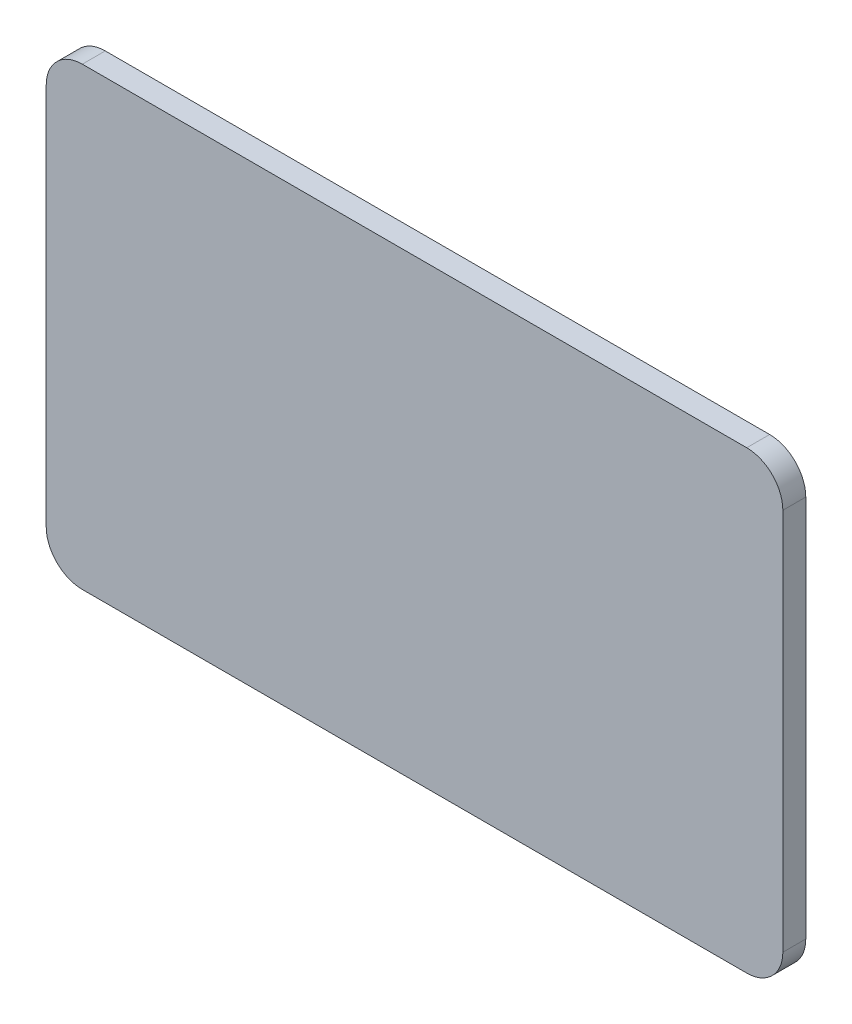
ISO-10303-21;
HEADER;
FILE_DESCRIPTION(('STEP AP214'),'2;1');
FILE_NAME('part.step','',(''),(''),'','','');
FILE_SCHEMA(('AUTOMOTIVE_DESIGN { 1 0 10303 214 1 1 1 1 }'));
ENDSEC;
DATA;
#1=APPLICATION_CONTEXT('core data for automotive mechanical design processes');
#2=APPLICATION_PROTOCOL_DEFINITION('international standard','automotive_design',2000,#1);
#3=PRODUCT_CONTEXT('',#1,'mechanical');
#4=PRODUCT('Part','Part','',(#3));
#5=PRODUCT_RELATED_PRODUCT_CATEGORY('part','',(#4));
#6=PRODUCT_DEFINITION_FORMATION('','',#4);
#7=PRODUCT_DEFINITION_CONTEXT('part definition',#1,'design');
#8=PRODUCT_DEFINITION('design','',#6,#7);
#9=PRODUCT_DEFINITION_SHAPE('','',#8);
#10=(LENGTH_UNIT() NAMED_UNIT(*) SI_UNIT(.MILLI.,.METRE.));
#11=(NAMED_UNIT(*) PLANE_ANGLE_UNIT() SI_UNIT($,.RADIAN.));
#12=(NAMED_UNIT(*) SI_UNIT($,.STERADIAN.) SOLID_ANGLE_UNIT());
#13=UNCERTAINTY_MEASURE_WITH_UNIT(LENGTH_MEASURE(1.E-05),#10,'distance_accuracy_value','');
#14=(GEOMETRIC_REPRESENTATION_CONTEXT(3) GLOBAL_UNCERTAINTY_ASSIGNED_CONTEXT((#13)) GLOBAL_UNIT_ASSIGNED_CONTEXT((#10,
#11,#12)) REPRESENTATION_CONTEXT('',''));
#15=CARTESIAN_POINT('',(0.,0.,0.));
#16=DIRECTION('',(0.,0.,1.));
#17=DIRECTION('',(1.,0.,0.));
#18=AXIS2_PLACEMENT_3D('',#15,#16,#17);
#19=CARTESIAN_POINT('',(51.,-31.5,3.175));
#20=DIRECTION('',(-1.,0.,0.));
#21=DIRECTION('',(0.,0.,1.));
#22=AXIS2_PLACEMENT_3D('',#19,#20,#21);
#23=PLANE('',#22);
#24=DIRECTION('',(0.,1.,0.));
#25=VECTOR('',#24,1.);
#26=CARTESIAN_POINT('',(51.,-31.5,3.175));
#27=LINE('',#26,#25);
#28=CARTESIAN_POINT('',(51.,-26.5,3.175));
#29=VERTEX_POINT('',#28);
#30=CARTESIAN_POINT('',(51.,26.5,3.175));
#31=VERTEX_POINT('',#30);
#32=EDGE_CURVE('E135',#29,#31,#27,.T.);
#33=ORIENTED_EDGE('',*,*,#32,.F.);
#34=DIRECTION('',(0.,0.,-1.));
#35=VECTOR('',#34,1.);
#36=CARTESIAN_POINT('',(51.,-26.5,3.175));
#37=LINE('',#36,#35);
#38=CARTESIAN_POINT('',(51.,-26.5,0.));
#39=VERTEX_POINT('',#38);
#40=EDGE_CURVE('E11',#29,#39,#37,.T.);
#41=ORIENTED_EDGE('',*,*,#40,.T.);
#42=DIRECTION('',(0.,1.,0.));
#43=VECTOR('',#42,1.);
#44=CARTESIAN_POINT('',(51.,-31.5,0.));
#45=LINE('',#44,#43);
#46=CARTESIAN_POINT('',(51.,26.5,0.));
#47=VERTEX_POINT('',#46);
#48=EDGE_CURVE('E166',#39,#47,#45,.T.);
#49=ORIENTED_EDGE('',*,*,#48,.T.);
#50=DIRECTION('',(0.,0.,-1.));
#51=VECTOR('',#50,1.);
#52=CARTESIAN_POINT('',(51.,26.5,3.175));
#53=LINE('',#52,#51);
#54=EDGE_CURVE('E49',#47,#31,#53,.F.);
#55=ORIENTED_EDGE('',*,*,#54,.T.);
#56=EDGE_LOOP('',(#33,#41,#49,#55));
#57=FACE_BOUND('',#56,.T.);
#58=ADVANCED_FACE('F41',(#57),#23,.F.);
#59=CARTESIAN_POINT('',(-51.,31.5,3.175));
#60=DIRECTION('',(0.,-1.,0.));
#61=DIRECTION('',(0.,0.,-1.));
#62=AXIS2_PLACEMENT_3D('',#59,#60,#61);
#63=PLANE('',#62);
#64=DIRECTION('',(-1.,0.,0.));
#65=VECTOR('',#64,1.);
#66=CARTESIAN_POINT('',(-51.,31.5,0.));
#67=LINE('',#66,#65);
#68=CARTESIAN_POINT('',(46.,31.5,0.));
#69=VERTEX_POINT('',#68);
#70=CARTESIAN_POINT('',(-46.,31.5,0.));
#71=VERTEX_POINT('',#70);
#72=EDGE_CURVE('E140',#69,#71,#67,.T.);
#73=ORIENTED_EDGE('',*,*,#72,.T.);
#74=DIRECTION('',(0.,0.,-1.));
#75=VECTOR('',#74,1.);
#76=CARTESIAN_POINT('',(-46.,31.5,3.175));
#77=LINE('',#76,#75);
#78=CARTESIAN_POINT('',(-46.,31.5,3.175));
#79=VERTEX_POINT('',#78);
#80=EDGE_CURVE('E56',#71,#79,#77,.F.);
#81=ORIENTED_EDGE('',*,*,#80,.T.);
#82=DIRECTION('',(-1.,0.,0.));
#83=VECTOR('',#82,1.);
#84=CARTESIAN_POINT('',(-51.,31.5,3.175));
#85=LINE('',#84,#83);
#86=CARTESIAN_POINT('',(46.,31.5,3.175));
#87=VERTEX_POINT('',#86);
#88=EDGE_CURVE('E138',#87,#79,#85,.T.);
#89=ORIENTED_EDGE('',*,*,#88,.F.);
#90=DIRECTION('',(0.,0.,-1.));
#91=VECTOR('',#90,1.);
#92=CARTESIAN_POINT('',(46.,31.5,3.175));
#93=LINE('',#92,#91);
#94=EDGE_CURVE('E158',#87,#69,#93,.T.);
#95=ORIENTED_EDGE('',*,*,#94,.T.);
#96=EDGE_LOOP('',(#73,#81,#89,#95));
#97=FACE_BOUND('',#96,.T.);
#98=ADVANCED_FACE('F173',(#97),#63,.F.);
#99=CARTESIAN_POINT('',(-51.,-31.5,3.175));
#100=DIRECTION('',(1.,0.,0.));
#101=DIRECTION('',(0.,0.,-1.));
#102=AXIS2_PLACEMENT_3D('',#99,#100,#101);
#103=PLANE('',#102);
#104=DIRECTION('',(0.,-1.,0.));
#105=VECTOR('',#104,1.);
#106=CARTESIAN_POINT('',(-51.,-31.5,0.));
#107=LINE('',#106,#105);
#108=CARTESIAN_POINT('',(-51.,26.5,0.));
#109=VERTEX_POINT('',#108);
#110=CARTESIAN_POINT('',(-51.,-26.5,0.));
#111=VERTEX_POINT('',#110);
#112=EDGE_CURVE('E136',#109,#111,#107,.T.);
#113=ORIENTED_EDGE('',*,*,#112,.T.);
#114=DIRECTION('',(0.,0.,-1.));
#115=VECTOR('',#114,1.);
#116=CARTESIAN_POINT('',(-51.,-26.5,3.175));
#117=LINE('',#116,#115);
#118=CARTESIAN_POINT('',(-51.,-26.5,3.175));
#119=VERTEX_POINT('',#118);
#120=EDGE_CURVE('E113',#111,#119,#117,.F.);
#121=ORIENTED_EDGE('',*,*,#120,.T.);
#122=DIRECTION('',(0.,-1.,0.));
#123=VECTOR('',#122,1.);
#124=CARTESIAN_POINT('',(-51.,-31.5,3.175));
#125=LINE('',#124,#123);
#126=CARTESIAN_POINT('',(-51.,26.5,3.175));
#127=VERTEX_POINT('',#126);
#128=EDGE_CURVE('E177',#127,#119,#125,.T.);
#129=ORIENTED_EDGE('',*,*,#128,.F.);
#130=DIRECTION('',(0.,0.,-1.));
#131=VECTOR('',#130,1.);
#132=CARTESIAN_POINT('',(-51.,26.5,3.175));
#133=LINE('',#132,#131);
#134=EDGE_CURVE('E118',#127,#109,#133,.T.);
#135=ORIENTED_EDGE('',*,*,#134,.T.);
#136=EDGE_LOOP('',(#113,#121,#129,#135));
#137=FACE_BOUND('',#136,.T.);
#138=ADVANCED_FACE('F185',(#137),#103,.F.);
#139=CARTESIAN_POINT('',(-51.,-31.5,3.175));
#140=DIRECTION('',(0.,1.,0.));
#141=DIRECTION('',(0.,0.,1.));
#142=AXIS2_PLACEMENT_3D('',#139,#140,#141);
#143=PLANE('',#142);
#144=DIRECTION('',(1.,0.,0.));
#145=VECTOR('',#144,1.);
#146=CARTESIAN_POINT('',(-51.,-31.5,3.175));
#147=LINE('',#146,#145);
#148=CARTESIAN_POINT('',(-46.,-31.5,3.175));
#149=VERTEX_POINT('',#148);
#150=CARTESIAN_POINT('',(46.,-31.5,3.175));
#151=VERTEX_POINT('',#150);
#152=EDGE_CURVE('E128',#149,#151,#147,.T.);
#153=ORIENTED_EDGE('',*,*,#152,.F.);
#154=DIRECTION('',(0.,0.,-1.));
#155=VECTOR('',#154,1.);
#156=CARTESIAN_POINT('',(-46.,-31.5,3.175));
#157=LINE('',#156,#155);
#158=CARTESIAN_POINT('',(-46.,-31.5,0.));
#159=VERTEX_POINT('',#158);
#160=EDGE_CURVE('E112',#149,#159,#157,.T.);
#161=ORIENTED_EDGE('',*,*,#160,.T.);
#162=DIRECTION('',(1.,0.,0.));
#163=VECTOR('',#162,1.);
#164=CARTESIAN_POINT('',(-51.,-31.5,0.));
#165=LINE('',#164,#163);
#166=CARTESIAN_POINT('',(46.,-31.5,0.));
#167=VERTEX_POINT('',#166);
#168=EDGE_CURVE('E125',#159,#167,#165,.T.);
#169=ORIENTED_EDGE('',*,*,#168,.T.);
#170=DIRECTION('',(0.,0.,-1.));
#171=VECTOR('',#170,1.);
#172=CARTESIAN_POINT('',(46.,-31.5,3.175));
#173=LINE('',#172,#171);
#174=EDGE_CURVE('E130',#167,#151,#173,.F.);
#175=ORIENTED_EDGE('',*,*,#174,.T.);
#176=EDGE_LOOP('',(#153,#161,#169,#175));
#177=FACE_BOUND('',#176,.T.);
#178=ADVANCED_FACE('F124',(#177),#143,.F.);
#179=CARTESIAN_POINT('',(0.,0.,3.175));
#180=DIRECTION('',(0.,0.,-1.));
#181=DIRECTION('',(-1.,0.,0.));
#182=AXIS2_PLACEMENT_3D('',#179,#180,#181);
#183=PLANE('',#182);
#184=ORIENTED_EDGE('',*,*,#128,.T.);
#185=CARTESIAN_POINT('',(-46.,-26.5,3.175));
#186=DIRECTION('',(0.,0.,-1.));
#187=DIRECTION('',(-1.,0.,0.));
#188=AXIS2_PLACEMENT_3D('',#185,#186,#187);
#189=CIRCLE('',#188,5.);
#190=EDGE_CURVE('E156',#119,#149,#189,.F.);
#191=ORIENTED_EDGE('',*,*,#190,.T.);
#192=ORIENTED_EDGE('',*,*,#152,.T.);
#193=CARTESIAN_POINT('',(46.,-26.5,3.175));
#194=DIRECTION('',(0.,0.,-1.));
#195=DIRECTION('',(-1.,0.,0.));
#196=AXIS2_PLACEMENT_3D('',#193,#194,#195);
#197=CIRCLE('',#196,5.);
#198=EDGE_CURVE('E152',#151,#29,#197,.F.);
#199=ORIENTED_EDGE('',*,*,#198,.T.);
#200=ORIENTED_EDGE('',*,*,#32,.T.);
#201=CARTESIAN_POINT('',(46.,26.5,3.175));
#202=DIRECTION('',(0.,0.,-1.));
#203=DIRECTION('',(-1.,0.,0.));
#204=AXIS2_PLACEMENT_3D('',#201,#202,#203);
#205=CIRCLE('',#204,5.);
#206=EDGE_CURVE('E63',#31,#87,#205,.F.);
#207=ORIENTED_EDGE('',*,*,#206,.T.);
#208=ORIENTED_EDGE('',*,*,#88,.T.);
#209=CARTESIAN_POINT('',(-46.,26.5,3.175));
#210=DIRECTION('',(0.,0.,-1.));
#211=DIRECTION('',(-1.,0.,0.));
#212=AXIS2_PLACEMENT_3D('',#209,#210,#211);
#213=CIRCLE('',#212,5.);
#214=EDGE_CURVE('E154',#79,#127,#213,.F.);
#215=ORIENTED_EDGE('',*,*,#214,.T.);
#216=EDGE_LOOP('',(#184,#191,#192,#199,#200,#207,#208,#215));
#217=FACE_BOUND('',#216,.T.);
#218=ADVANCED_FACE('F169',(#217),#183,.F.);
#219=CARTESIAN_POINT('',(0.,0.,0.));
#220=DIRECTION('',(0.,0.,-1.));
#221=DIRECTION('',(-1.,0.,0.));
#222=AXIS2_PLACEMENT_3D('',#219,#220,#221);
#223=PLANE('',#222);
#224=ORIENTED_EDGE('',*,*,#168,.F.);
#225=CARTESIAN_POINT('',(-46.,-26.5,0.));
#226=DIRECTION('',(0.,0.,-1.));
#227=DIRECTION('',(-1.,0.,0.));
#228=AXIS2_PLACEMENT_3D('',#225,#226,#227);
#229=CIRCLE('',#228,5.);
#230=EDGE_CURVE('E108',#159,#111,#229,.T.);
#231=ORIENTED_EDGE('',*,*,#230,.T.);
#232=ORIENTED_EDGE('',*,*,#112,.F.);
#233=CARTESIAN_POINT('',(-46.,26.5,0.));
#234=DIRECTION('',(0.,0.,-1.));
#235=DIRECTION('',(-1.,0.,0.));
#236=AXIS2_PLACEMENT_3D('',#233,#234,#235);
#237=CIRCLE('',#236,5.);
#238=EDGE_CURVE('E119',#109,#71,#237,.T.);
#239=ORIENTED_EDGE('',*,*,#238,.T.);
#240=ORIENTED_EDGE('',*,*,#72,.F.);
#241=CARTESIAN_POINT('',(46.,26.5,0.));
#242=DIRECTION('',(0.,0.,-1.));
#243=DIRECTION('',(-1.,0.,0.));
#244=AXIS2_PLACEMENT_3D('',#241,#242,#243);
#245=CIRCLE('',#244,5.);
#246=EDGE_CURVE('E129',#69,#47,#245,.T.);
#247=ORIENTED_EDGE('',*,*,#246,.T.);
#248=ORIENTED_EDGE('',*,*,#48,.F.);
#249=CARTESIAN_POINT('',(46.,-26.5,0.));
#250=DIRECTION('',(0.,0.,-1.));
#251=DIRECTION('',(-1.,0.,0.));
#252=AXIS2_PLACEMENT_3D('',#249,#250,#251);
#253=CIRCLE('',#252,5.);
#254=EDGE_CURVE('E134',#39,#167,#253,.T.);
#255=ORIENTED_EDGE('',*,*,#254,.T.);
#256=EDGE_LOOP('',(#224,#231,#232,#239,#240,#247,#248,#255));
#257=FACE_BOUND('',#256,.T.);
#258=ADVANCED_FACE('F132',(#257),#223,.T.);
#259=CARTESIAN_POINT('',(-46.,-26.5,3.175));
#260=DIRECTION('',(0.,0.,-1.));
#261=DIRECTION('',(-1.,0.,0.));
#262=AXIS2_PLACEMENT_3D('',#259,#260,#261);
#263=CYLINDRICAL_SURFACE('',#262,5.);
#264=ORIENTED_EDGE('',*,*,#190,.F.);
#265=ORIENTED_EDGE('',*,*,#120,.F.);
#266=ORIENTED_EDGE('',*,*,#230,.F.);
#267=ORIENTED_EDGE('',*,*,#160,.F.);
#268=EDGE_LOOP('',(#264,#265,#266,#267));
#269=FACE_BOUND('',#268,.T.);
#270=ADVANCED_FACE('F111',(#269),#263,.T.);
#271=CARTESIAN_POINT('',(-46.,26.5,3.175));
#272=DIRECTION('',(0.,0.,-1.));
#273=DIRECTION('',(-1.,0.,0.));
#274=AXIS2_PLACEMENT_3D('',#271,#272,#273);
#275=CYLINDRICAL_SURFACE('',#274,5.);
#276=ORIENTED_EDGE('',*,*,#214,.F.);
#277=ORIENTED_EDGE('',*,*,#80,.F.);
#278=ORIENTED_EDGE('',*,*,#238,.F.);
#279=ORIENTED_EDGE('',*,*,#134,.F.);
#280=EDGE_LOOP('',(#276,#277,#278,#279));
#281=FACE_BOUND('',#280,.T.);
#282=ADVANCED_FACE('F183',(#281),#275,.T.);
#283=CARTESIAN_POINT('',(46.,-26.5,3.175));
#284=DIRECTION('',(0.,0.,-1.));
#285=DIRECTION('',(-1.,0.,0.));
#286=AXIS2_PLACEMENT_3D('',#283,#284,#285);
#287=CYLINDRICAL_SURFACE('',#286,5.);
#288=ORIENTED_EDGE('',*,*,#198,.F.);
#289=ORIENTED_EDGE('',*,*,#174,.F.);
#290=ORIENTED_EDGE('',*,*,#254,.F.);
#291=ORIENTED_EDGE('',*,*,#40,.F.);
#292=EDGE_LOOP('',(#288,#289,#290,#291));
#293=FACE_BOUND('',#292,.T.);
#294=ADVANCED_FACE('F187',(#293),#287,.T.);
#295=CARTESIAN_POINT('',(46.,26.5,3.175));
#296=DIRECTION('',(0.,0.,-1.));
#297=DIRECTION('',(-1.,0.,0.));
#298=AXIS2_PLACEMENT_3D('',#295,#296,#297);
#299=CYLINDRICAL_SURFACE('',#298,5.);
#300=ORIENTED_EDGE('',*,*,#206,.F.);
#301=ORIENTED_EDGE('',*,*,#54,.F.);
#302=ORIENTED_EDGE('',*,*,#246,.F.);
#303=ORIENTED_EDGE('',*,*,#94,.F.);
#304=EDGE_LOOP('',(#300,#301,#302,#303));
#305=FACE_BOUND('',#304,.T.);
#306=ADVANCED_FACE('F43',(#305),#299,.T.);
#307=CLOSED_SHELL('',(#58,#98,#138,#178,#218,#258,#270,#282,#294,#306));
#308=MANIFOLD_SOLID_BREP('B2',#307);
#309=ADVANCED_BREP_SHAPE_REPRESENTATION('',(#18,#308),#14);
#310=SHAPE_DEFINITION_REPRESENTATION(#9,#309);
ENDSEC;
END-ISO-10303-21;
